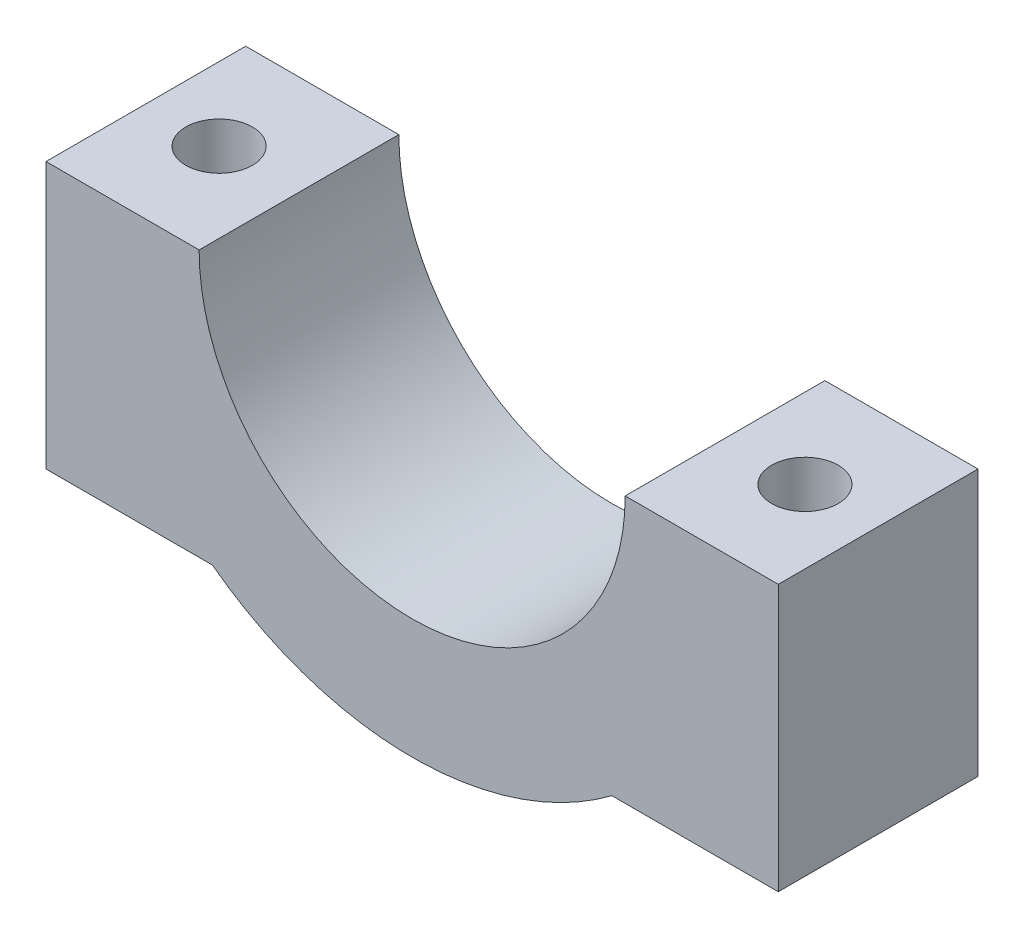
ISO-10303-21;
HEADER;
FILE_DESCRIPTION(('STEP AP214'),'2;1');
FILE_NAME('part.step','',(''),(''),'','','');
FILE_SCHEMA(('AUTOMOTIVE_DESIGN { 1 0 10303 214 1 1 1 1 }'));
ENDSEC;
DATA;
#1=APPLICATION_CONTEXT('core data for automotive mechanical design processes');
#2=APPLICATION_PROTOCOL_DEFINITION('international standard','automotive_design',2000,#1);
#3=PRODUCT_CONTEXT('',#1,'mechanical');
#4=PRODUCT('Part','Part','',(#3));
#5=PRODUCT_RELATED_PRODUCT_CATEGORY('part','',(#4));
#6=PRODUCT_DEFINITION_FORMATION('','',#4);
#7=PRODUCT_DEFINITION_CONTEXT('part definition',#1,'design');
#8=PRODUCT_DEFINITION('design','',#6,#7);
#9=PRODUCT_DEFINITION_SHAPE('','',#8);
#10=(LENGTH_UNIT() NAMED_UNIT(*) SI_UNIT(.MILLI.,.METRE.));
#11=(NAMED_UNIT(*) PLANE_ANGLE_UNIT() SI_UNIT($,.RADIAN.));
#12=(NAMED_UNIT(*) SI_UNIT($,.STERADIAN.) SOLID_ANGLE_UNIT());
#13=UNCERTAINTY_MEASURE_WITH_UNIT(LENGTH_MEASURE(1.E-05),#10,'distance_accuracy_value','');
#14=(GEOMETRIC_REPRESENTATION_CONTEXT(3) GLOBAL_UNCERTAINTY_ASSIGNED_CONTEXT((#13)) GLOBAL_UNIT_ASSIGNED_CONTEXT((#10,
#11,#12)) REPRESENTATION_CONTEXT('',''));
#15=CARTESIAN_POINT('',(0.,0.,0.));
#16=DIRECTION('',(0.,0.,1.));
#17=DIRECTION('',(1.,0.,0.));
#18=AXIS2_PLACEMENT_3D('',#15,#16,#17);
#19=CARTESIAN_POINT('',(0.,0.,-7.5));
#20=DIRECTION('',(0.,0.,1.));
#21=DIRECTION('',(1.,0.,0.));
#22=AXIS2_PLACEMENT_3D('',#19,#20,#21);
#23=CYLINDRICAL_SURFACE('',#22,16.);
#24=DIRECTION('',(0.,0.,1.));
#25=VECTOR('',#24,1.);
#26=CARTESIAN_POINT('',(-16.,0.,-7.5));
#27=LINE('',#26,#25);
#28=CARTESIAN_POINT('',(-16.,0.,-7.5));
#29=VERTEX_POINT('',#28);
#30=CARTESIAN_POINT('',(-16.,0.,7.5));
#31=VERTEX_POINT('',#30);
#32=EDGE_CURVE('E40',#29,#31,#27,.T.);
#33=ORIENTED_EDGE('',*,*,#32,.T.);
#34=CARTESIAN_POINT('',(0.,0.,7.5));
#35=DIRECTION('',(0.,0.,-1.));
#36=DIRECTION('',(-1.,0.,0.));
#37=AXIS2_PLACEMENT_3D('',#34,#35,#36);
#38=CIRCLE('',#37,16.);
#39=CARTESIAN_POINT('',(16.,0.,7.5));
#40=VERTEX_POINT('',#39);
#41=EDGE_CURVE('E101',#40,#31,#38,.T.);
#42=ORIENTED_EDGE('',*,*,#41,.F.);
#43=DIRECTION('',(0.,0.,1.));
#44=VECTOR('',#43,1.);
#45=CARTESIAN_POINT('',(16.,0.,-7.5));
#46=LINE('',#45,#44);
#47=CARTESIAN_POINT('',(16.,0.,-7.5));
#48=VERTEX_POINT('',#47);
#49=EDGE_CURVE('E11',#48,#40,#46,.T.);
#50=ORIENTED_EDGE('',*,*,#49,.F.);
#51=CARTESIAN_POINT('',(0.,0.,-7.5));
#52=DIRECTION('',(0.,0.,-1.));
#53=DIRECTION('',(-1.,0.,0.));
#54=AXIS2_PLACEMENT_3D('',#51,#52,#53);
#55=CIRCLE('',#54,16.);
#56=EDGE_CURVE('E102',#48,#29,#55,.T.);
#57=ORIENTED_EDGE('',*,*,#56,.T.);
#58=EDGE_LOOP('',(#33,#42,#50,#57));
#59=FACE_BOUND('',#58,.T.);
#60=ADVANCED_FACE('F37',(#59),#23,.F.);
#61=CARTESIAN_POINT('',(27.5,0.,-7.5));
#62=DIRECTION('',(0.,1.,0.));
#63=DIRECTION('',(-1.,0.,0.));
#64=AXIS2_PLACEMENT_3D('',#61,#62,#63);
#65=PLANE('',#64);
#66=CARTESIAN_POINT('',(22.,0.,0.));
#67=DIRECTION('',(0.,-1.,0.));
#68=DIRECTION('',(0.,0.,-1.));
#69=AXIS2_PLACEMENT_3D('',#66,#67,#68);
#70=CIRCLE('',#69,2.5);
#71=CARTESIAN_POINT('',(22.,0.,-2.5));
#72=VERTEX_POINT('',#71);
#73=EDGE_CURVE('E120',#72,#72,#70,.T.);
#74=ORIENTED_EDGE('',*,*,#73,.T.);
#75=EDGE_LOOP('',(#74));
#76=FACE_BOUND('',#75,.T.);
#77=ORIENTED_EDGE('',*,*,#49,.T.);
#78=DIRECTION('',(-1.,0.,0.));
#79=VECTOR('',#78,1.);
#80=CARTESIAN_POINT('',(27.5,0.,7.5));
#81=LINE('',#80,#79);
#82=CARTESIAN_POINT('',(27.5,0.,7.5));
#83=VERTEX_POINT('',#82);
#84=EDGE_CURVE('E119',#83,#40,#81,.T.);
#85=ORIENTED_EDGE('',*,*,#84,.F.);
#86=DIRECTION('',(0.,0.,1.));
#87=VECTOR('',#86,1.);
#88=CARTESIAN_POINT('',(27.5,0.,-7.5));
#89=LINE('',#88,#87);
#90=CARTESIAN_POINT('',(27.5,0.,-7.5));
#91=VERTEX_POINT('',#90);
#92=EDGE_CURVE('E45',#91,#83,#89,.T.);
#93=ORIENTED_EDGE('',*,*,#92,.F.);
#94=DIRECTION('',(-1.,0.,0.));
#95=VECTOR('',#94,1.);
#96=CARTESIAN_POINT('',(27.5,0.,-7.5));
#97=LINE('',#96,#95);
#98=EDGE_CURVE('E107',#91,#48,#97,.T.);
#99=ORIENTED_EDGE('',*,*,#98,.T.);
#100=EDGE_LOOP('',(#77,#85,#93,#99));
#101=FACE_BOUND('',#100,.T.);
#102=ADVANCED_FACE('F188',(#76,#101),#65,.T.);
#103=CARTESIAN_POINT('',(27.5,-20.,-7.5));
#104=DIRECTION('',(1.,0.,0.));
#105=DIRECTION('',(0.,0.,-1.));
#106=AXIS2_PLACEMENT_3D('',#103,#104,#105);
#107=PLANE('',#106);
#108=ORIENTED_EDGE('',*,*,#92,.T.);
#109=DIRECTION('',(0.,1.,0.));
#110=VECTOR('',#109,1.);
#111=CARTESIAN_POINT('',(27.5,-20.,7.5));
#112=LINE('',#111,#110);
#113=CARTESIAN_POINT('',(27.5,-20.,7.5));
#114=VERTEX_POINT('',#113);
#115=EDGE_CURVE('E137',#114,#83,#112,.T.);
#116=ORIENTED_EDGE('',*,*,#115,.F.);
#117=DIRECTION('',(0.,0.,1.));
#118=VECTOR('',#117,1.);
#119=CARTESIAN_POINT('',(27.5,-20.,-7.5));
#120=LINE('',#119,#118);
#121=CARTESIAN_POINT('',(27.5,-20.,-7.5));
#122=VERTEX_POINT('',#121);
#123=EDGE_CURVE('E159',#122,#114,#120,.T.);
#124=ORIENTED_EDGE('',*,*,#123,.F.);
#125=DIRECTION('',(0.,1.,0.));
#126=VECTOR('',#125,1.);
#127=CARTESIAN_POINT('',(27.5,-20.,-7.5));
#128=LINE('',#127,#126);
#129=EDGE_CURVE('E155',#122,#91,#128,.T.);
#130=ORIENTED_EDGE('',*,*,#129,.T.);
#131=EDGE_LOOP('',(#108,#116,#124,#130));
#132=FACE_BOUND('',#131,.T.);
#133=ADVANCED_FACE('F187',(#132),#107,.T.);
#134=CARTESIAN_POINT('',(27.5,-20.,-7.5));
#135=DIRECTION('',(0.,-1.,0.));
#136=DIRECTION('',(1.,0.,0.));
#137=AXIS2_PLACEMENT_3D('',#134,#135,#136);
#138=PLANE('',#137);
#139=CARTESIAN_POINT('',(22.,-20.,0.));
#140=DIRECTION('',(0.,-1.,0.));
#141=DIRECTION('',(0.,0.,-1.));
#142=AXIS2_PLACEMENT_3D('',#139,#140,#141);
#143=CIRCLE('',#142,2.49999999999999);
#144=CARTESIAN_POINT('',(22.,-20.,-2.49999999999999));
#145=VERTEX_POINT('',#144);
#146=EDGE_CURVE('E123',#145,#145,#143,.T.);
#147=ORIENTED_EDGE('',*,*,#146,.F.);
#148=EDGE_LOOP('',(#147));
#149=FACE_BOUND('',#148,.T.);
#150=ORIENTED_EDGE('',*,*,#123,.T.);
#151=DIRECTION('',(1.,0.,0.));
#152=VECTOR('',#151,1.);
#153=CARTESIAN_POINT('',(27.5,-20.,7.5));
#154=LINE('',#153,#152);
#155=CARTESIAN_POINT('',(14.9999999999998,-20.,7.5));
#156=VERTEX_POINT('',#155);
#157=EDGE_CURVE('E134',#156,#114,#154,.T.);
#158=ORIENTED_EDGE('',*,*,#157,.F.);
#159=DIRECTION('',(0.,0.,1.));
#160=VECTOR('',#159,1.);
#161=CARTESIAN_POINT('',(14.9999999999998,-20.,-7.5));
#162=LINE('',#161,#160);
#163=CARTESIAN_POINT('',(14.9999999999998,-20.,-7.5));
#164=VERTEX_POINT('',#163);
#165=EDGE_CURVE('E161',#164,#156,#162,.T.);
#166=ORIENTED_EDGE('',*,*,#165,.F.);
#167=DIRECTION('',(1.,0.,0.));
#168=VECTOR('',#167,1.);
#169=CARTESIAN_POINT('',(27.5,-20.,-7.5));
#170=LINE('',#169,#168);
#171=EDGE_CURVE('E152',#164,#122,#170,.T.);
#172=ORIENTED_EDGE('',*,*,#171,.T.);
#173=EDGE_LOOP('',(#150,#158,#166,#172));
#174=FACE_BOUND('',#173,.T.);
#175=ADVANCED_FACE('F183',(#149,#174),#138,.T.);
#176=CARTESIAN_POINT('',(0.,0.,-7.5));
#177=DIRECTION('',(0.,0.,1.));
#178=DIRECTION('',(1.,0.,0.));
#179=AXIS2_PLACEMENT_3D('',#176,#177,#178);
#180=CYLINDRICAL_SURFACE('',#179,24.9999999999999);
#181=ORIENTED_EDGE('',*,*,#165,.T.);
#182=CARTESIAN_POINT('',(0.,0.,7.5));
#183=DIRECTION('',(0.,0.,1.));
#184=DIRECTION('',(-1.,0.,0.));
#185=AXIS2_PLACEMENT_3D('',#182,#183,#184);
#186=CIRCLE('',#185,24.9999999999999);
#187=CARTESIAN_POINT('',(-14.9999999999998,-20.,7.5));
#188=VERTEX_POINT('',#187);
#189=EDGE_CURVE('E131',#188,#156,#186,.T.);
#190=ORIENTED_EDGE('',*,*,#189,.F.);
#191=DIRECTION('',(0.,0.,1.));
#192=VECTOR('',#191,1.);
#193=CARTESIAN_POINT('',(-14.9999999999998,-20.,-7.5));
#194=LINE('',#193,#192);
#195=CARTESIAN_POINT('',(-14.9999999999998,-20.,-7.5));
#196=VERTEX_POINT('',#195);
#197=EDGE_CURVE('E163',#196,#188,#194,.T.);
#198=ORIENTED_EDGE('',*,*,#197,.F.);
#199=CARTESIAN_POINT('',(0.,0.,-7.5));
#200=DIRECTION('',(0.,0.,1.));
#201=DIRECTION('',(-1.,0.,0.));
#202=AXIS2_PLACEMENT_3D('',#199,#200,#201);
#203=CIRCLE('',#202,24.9999999999999);
#204=EDGE_CURVE('E149',#196,#164,#203,.T.);
#205=ORIENTED_EDGE('',*,*,#204,.T.);
#206=EDGE_LOOP('',(#181,#190,#198,#205));
#207=FACE_BOUND('',#206,.T.);
#208=ADVANCED_FACE('F176',(#207),#180,.T.);
#209=CARTESIAN_POINT('',(-14.9999999999998,-20.,-7.5));
#210=DIRECTION('',(0.,-1.,0.));
#211=DIRECTION('',(1.,0.,0.));
#212=AXIS2_PLACEMENT_3D('',#209,#210,#211);
#213=PLANE('',#212);
#214=CARTESIAN_POINT('',(-22.,-20.,0.));
#215=DIRECTION('',(0.,-1.,0.));
#216=DIRECTION('',(0.,0.,-1.));
#217=AXIS2_PLACEMENT_3D('',#214,#215,#216);
#218=CIRCLE('',#217,2.49999999999999);
#219=CARTESIAN_POINT('',(-22.,-20.,-2.49999999999999));
#220=VERTEX_POINT('',#219);
#221=EDGE_CURVE('E218',#220,#220,#218,.T.);
#222=ORIENTED_EDGE('',*,*,#221,.F.);
#223=EDGE_LOOP('',(#222));
#224=FACE_BOUND('',#223,.T.);
#225=ORIENTED_EDGE('',*,*,#197,.T.);
#226=DIRECTION('',(1.,0.,0.));
#227=VECTOR('',#226,1.);
#228=CARTESIAN_POINT('',(-14.9999999999998,-20.,7.5));
#229=LINE('',#228,#227);
#230=CARTESIAN_POINT('',(-27.5,-20.,7.5));
#231=VERTEX_POINT('',#230);
#232=EDGE_CURVE('E128',#231,#188,#229,.T.);
#233=ORIENTED_EDGE('',*,*,#232,.F.);
#234=DIRECTION('',(0.,0.,1.));
#235=VECTOR('',#234,1.);
#236=CARTESIAN_POINT('',(-27.5,-20.,-7.5));
#237=LINE('',#236,#235);
#238=CARTESIAN_POINT('',(-27.5,-20.,-7.5));
#239=VERTEX_POINT('',#238);
#240=EDGE_CURVE('E165',#239,#231,#237,.T.);
#241=ORIENTED_EDGE('',*,*,#240,.F.);
#242=DIRECTION('',(1.,0.,0.));
#243=VECTOR('',#242,1.);
#244=CARTESIAN_POINT('',(-14.9999999999998,-20.,-7.5));
#245=LINE('',#244,#243);
#246=EDGE_CURVE('E146',#239,#196,#245,.T.);
#247=ORIENTED_EDGE('',*,*,#246,.T.);
#248=EDGE_LOOP('',(#225,#233,#241,#247));
#249=FACE_BOUND('',#248,.T.);
#250=ADVANCED_FACE('F173',(#224,#249),#213,.T.);
#251=CARTESIAN_POINT('',(-27.5,-20.,-7.5));
#252=DIRECTION('',(-1.,0.,0.));
#253=DIRECTION('',(0.,0.,1.));
#254=AXIS2_PLACEMENT_3D('',#251,#252,#253);
#255=PLANE('',#254);
#256=ORIENTED_EDGE('',*,*,#240,.T.);
#257=DIRECTION('',(0.,-1.,0.));
#258=VECTOR('',#257,1.);
#259=CARTESIAN_POINT('',(-27.5,-20.,7.5));
#260=LINE('',#259,#258);
#261=CARTESIAN_POINT('',(-27.5,0.,7.5));
#262=VERTEX_POINT('',#261);
#263=EDGE_CURVE('E114',#262,#231,#260,.T.);
#264=ORIENTED_EDGE('',*,*,#263,.F.);
#265=DIRECTION('',(0.,0.,1.));
#266=VECTOR('',#265,1.);
#267=CARTESIAN_POINT('',(-27.5,0.,-7.5));
#268=LINE('',#267,#266);
#269=CARTESIAN_POINT('',(-27.5,0.,-7.5));
#270=VERTEX_POINT('',#269);
#271=EDGE_CURVE('E106',#270,#262,#268,.T.);
#272=ORIENTED_EDGE('',*,*,#271,.F.);
#273=DIRECTION('',(0.,-1.,0.));
#274=VECTOR('',#273,1.);
#275=CARTESIAN_POINT('',(-27.5,-20.,-7.5));
#276=LINE('',#275,#274);
#277=EDGE_CURVE('E143',#270,#239,#276,.T.);
#278=ORIENTED_EDGE('',*,*,#277,.T.);
#279=EDGE_LOOP('',(#256,#264,#272,#278));
#280=FACE_BOUND('',#279,.T.);
#281=ADVANCED_FACE('F167',(#280),#255,.T.);
#282=CARTESIAN_POINT('',(-27.5,0.,-7.5));
#283=DIRECTION('',(0.,1.,0.));
#284=DIRECTION('',(-1.,0.,0.));
#285=AXIS2_PLACEMENT_3D('',#282,#283,#284);
#286=PLANE('',#285);
#287=CARTESIAN_POINT('',(-22.,0.,0.));
#288=DIRECTION('',(0.,-1.,0.));
#289=DIRECTION('',(0.,0.,-1.));
#290=AXIS2_PLACEMENT_3D('',#287,#288,#289);
#291=CIRCLE('',#290,2.5);
#292=CARTESIAN_POINT('',(-22.,0.,-2.5));
#293=VERTEX_POINT('',#292);
#294=EDGE_CURVE('E216',#293,#293,#291,.T.);
#295=ORIENTED_EDGE('',*,*,#294,.T.);
#296=EDGE_LOOP('',(#295));
#297=FACE_BOUND('',#296,.T.);
#298=ORIENTED_EDGE('',*,*,#271,.T.);
#299=DIRECTION('',(-1.,0.,0.));
#300=VECTOR('',#299,1.);
#301=CARTESIAN_POINT('',(-27.5,0.,7.5));
#302=LINE('',#301,#300);
#303=EDGE_CURVE('E109',#31,#262,#302,.T.);
#304=ORIENTED_EDGE('',*,*,#303,.F.);
#305=ORIENTED_EDGE('',*,*,#32,.F.);
#306=DIRECTION('',(-1.,0.,0.));
#307=VECTOR('',#306,1.);
#308=CARTESIAN_POINT('',(-27.5,0.,-7.5));
#309=LINE('',#308,#307);
#310=EDGE_CURVE('E141',#29,#270,#309,.T.);
#311=ORIENTED_EDGE('',*,*,#310,.T.);
#312=EDGE_LOOP('',(#298,#304,#305,#311));
#313=FACE_BOUND('',#312,.T.);
#314=ADVANCED_FACE('F110',(#297,#313),#286,.T.);
#315=CARTESIAN_POINT('',(0.,0.,-7.5));
#316=DIRECTION('',(0.,0.,-1.));
#317=DIRECTION('',(-1.,0.,0.));
#318=AXIS2_PLACEMENT_3D('',#315,#316,#317);
#319=PLANE('',#318);
#320=ORIENTED_EDGE('',*,*,#56,.F.);
#321=ORIENTED_EDGE('',*,*,#98,.F.);
#322=ORIENTED_EDGE('',*,*,#129,.F.);
#323=ORIENTED_EDGE('',*,*,#171,.F.);
#324=ORIENTED_EDGE('',*,*,#204,.F.);
#325=ORIENTED_EDGE('',*,*,#246,.F.);
#326=ORIENTED_EDGE('',*,*,#277,.F.);
#327=ORIENTED_EDGE('',*,*,#310,.F.);
#328=EDGE_LOOP('',(#320,#321,#322,#323,#324,#325,#326,#327));
#329=FACE_BOUND('',#328,.T.);
#330=ADVANCED_FACE('F179',(#329),#319,.T.);
#331=CARTESIAN_POINT('',(0.,0.,7.5));
#332=DIRECTION('',(0.,0.,-1.));
#333=DIRECTION('',(-1.,0.,0.));
#334=AXIS2_PLACEMENT_3D('',#331,#332,#333);
#335=PLANE('',#334);
#336=ORIENTED_EDGE('',*,*,#41,.T.);
#337=ORIENTED_EDGE('',*,*,#303,.T.);
#338=ORIENTED_EDGE('',*,*,#263,.T.);
#339=ORIENTED_EDGE('',*,*,#232,.T.);
#340=ORIENTED_EDGE('',*,*,#189,.T.);
#341=ORIENTED_EDGE('',*,*,#157,.T.);
#342=ORIENTED_EDGE('',*,*,#115,.T.);
#343=ORIENTED_EDGE('',*,*,#84,.T.);
#344=EDGE_LOOP('',(#336,#337,#338,#339,#340,#341,#342,#343));
#345=FACE_BOUND('',#344,.T.);
#346=ADVANCED_FACE('F117',(#345),#335,.F.);
#347=CARTESIAN_POINT('',(22.,-20.,0.));
#348=DIRECTION('',(0.,-1.,0.));
#349=DIRECTION('',(0.,0.,-1.));
#350=AXIS2_PLACEMENT_3D('',#347,#348,#349);
#351=CYLINDRICAL_SURFACE('',#350,2.49999999999999);
#352=ORIENTED_EDGE('',*,*,#73,.F.);
#353=EDGE_LOOP('',(#352));
#354=FACE_BOUND('',#353,.T.);
#355=ORIENTED_EDGE('',*,*,#146,.T.);
#356=EDGE_LOOP('',(#355));
#357=FACE_BOUND('',#356,.T.);
#358=ADVANCED_FACE('F227',(#354,#357),#351,.F.);
#359=CARTESIAN_POINT('',(-22.,-20.,0.));
#360=DIRECTION('',(0.,-1.,0.));
#361=DIRECTION('',(0.,0.,-1.));
#362=AXIS2_PLACEMENT_3D('',#359,#360,#361);
#363=CYLINDRICAL_SURFACE('',#362,2.49999999999999);
#364=ORIENTED_EDGE('',*,*,#294,.F.);
#365=EDGE_LOOP('',(#364));
#366=FACE_BOUND('',#365,.T.);
#367=ORIENTED_EDGE('',*,*,#221,.T.);
#368=EDGE_LOOP('',(#367));
#369=FACE_BOUND('',#368,.T.);
#370=ADVANCED_FACE('F225',(#366,#369),#363,.F.);
#371=CLOSED_SHELL('',(#60,#102,#133,#175,#208,#250,#281,#314,#330,#346,#358,#370));
#372=MANIFOLD_SOLID_BREP('B2',#371);
#373=ADVANCED_BREP_SHAPE_REPRESENTATION('',(#18,#372),#14);
#374=SHAPE_DEFINITION_REPRESENTATION(#9,#373);
ENDSEC;
END-ISO-10303-21;
